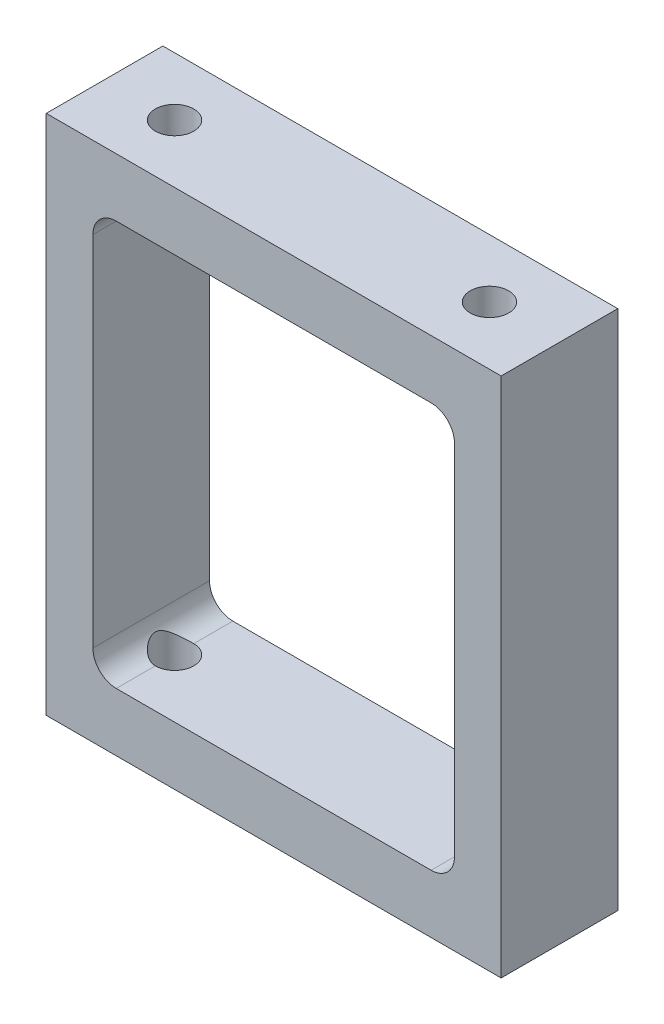
ISO-10303-21;
HEADER;
FILE_DESCRIPTION(('STEP AP214'),'2;1');
FILE_NAME('part.step','',(''),(''),'','','');
FILE_SCHEMA(('AUTOMOTIVE_DESIGN { 1 0 10303 214 1 1 1 1 }'));
ENDSEC;
DATA;
#1=APPLICATION_CONTEXT('core data for automotive mechanical design processes');
#2=APPLICATION_PROTOCOL_DEFINITION('international standard','automotive_design',2000,#1);
#3=PRODUCT_CONTEXT('',#1,'mechanical');
#4=PRODUCT('Part','Part','',(#3));
#5=PRODUCT_RELATED_PRODUCT_CATEGORY('part','',(#4));
#6=PRODUCT_DEFINITION_FORMATION('','',#4);
#7=PRODUCT_DEFINITION_CONTEXT('part definition',#1,'design');
#8=PRODUCT_DEFINITION('design','',#6,#7);
#9=PRODUCT_DEFINITION_SHAPE('','',#8);
#10=(LENGTH_UNIT() NAMED_UNIT(*) SI_UNIT(.MILLI.,.METRE.));
#11=(NAMED_UNIT(*) PLANE_ANGLE_UNIT() SI_UNIT($,.RADIAN.));
#12=(NAMED_UNIT(*) SI_UNIT($,.STERADIAN.) SOLID_ANGLE_UNIT());
#13=UNCERTAINTY_MEASURE_WITH_UNIT(LENGTH_MEASURE(1.E-05),#10,'distance_accuracy_value','');
#14=(GEOMETRIC_REPRESENTATION_CONTEXT(3) GLOBAL_UNCERTAINTY_ASSIGNED_CONTEXT((#13)) GLOBAL_UNIT_ASSIGNED_CONTEXT((#10,
#11,#12)) REPRESENTATION_CONTEXT('',''));
#15=CARTESIAN_POINT('',(0.,0.,0.));
#16=DIRECTION('',(0.,0.,1.));
#17=DIRECTION('',(1.,0.,0.));
#18=AXIS2_PLACEMENT_3D('',#15,#16,#17);
#19=CARTESIAN_POINT('',(0.,22.35,-5.));
#20=DIRECTION('',(1.,0.,0.));
#21=DIRECTION('',(0.,0.,-1.));
#22=AXIS2_PLACEMENT_3D('',#19,#20,#21);
#23=PLANE('',#22);
#24=DIRECTION('',(0.,0.,1.));
#25=VECTOR('',#24,1.);
#26=CARTESIAN_POINT('',(0.,-22.35,-5.));
#27=LINE('',#26,#25);
#28=CARTESIAN_POINT('',(0.,-22.35,-5.));
#29=VERTEX_POINT('',#28);
#30=CARTESIAN_POINT('',(0.,-22.35,5.));
#31=VERTEX_POINT('',#30);
#32=EDGE_CURVE('E246',#29,#31,#27,.T.);
#33=ORIENTED_EDGE('',*,*,#32,.T.);
#34=DIRECTION('',(0.,-1.,0.));
#35=VECTOR('',#34,1.);
#36=CARTESIAN_POINT('',(0.,22.35,5.));
#37=LINE('',#36,#35);
#38=CARTESIAN_POINT('',(0.,22.35,5.));
#39=VERTEX_POINT('',#38);
#40=EDGE_CURVE('E273',#39,#31,#37,.T.);
#41=ORIENTED_EDGE('',*,*,#40,.F.);
#42=DIRECTION('',(0.,0.,1.));
#43=VECTOR('',#42,1.);
#44=CARTESIAN_POINT('',(0.,22.35,-5.));
#45=LINE('',#44,#43);
#46=CARTESIAN_POINT('',(0.,22.35,-5.));
#47=VERTEX_POINT('',#46);
#48=EDGE_CURVE('E247',#47,#39,#45,.T.);
#49=ORIENTED_EDGE('',*,*,#48,.F.);
#50=DIRECTION('',(0.,-1.,0.));
#51=VECTOR('',#50,1.);
#52=CARTESIAN_POINT('',(0.,22.35,-5.));
#53=LINE('',#52,#51);
#54=EDGE_CURVE('E257',#47,#29,#53,.T.);
#55=ORIENTED_EDGE('',*,*,#54,.T.);
#56=EDGE_LOOP('',(#33,#41,#49,#55));
#57=FACE_BOUND('',#56,.T.);
#58=ADVANCED_FACE('F32',(#57),#23,.F.);
#59=CARTESIAN_POINT('',(0.,22.35,5.));
#60=DIRECTION('',(0.,0.,-1.));
#61=DIRECTION('',(-1.,0.,0.));
#62=AXIS2_PLACEMENT_3D('',#59,#60,#61);
#63=PLANE('',#62);
#64=DIRECTION('',(0.,1.,0.));
#65=VECTOR('',#64,1.);
#66=CARTESIAN_POINT('',(4.,15.35,5.));
#67=LINE('',#66,#65);
#68=CARTESIAN_POINT('',(4.,-15.35,5.));
#69=VERTEX_POINT('',#68);
#70=CARTESIAN_POINT('',(4.,15.35,5.));
#71=VERTEX_POINT('',#70);
#72=EDGE_CURVE('E173',#69,#71,#67,.T.);
#73=ORIENTED_EDGE('',*,*,#72,.T.);
#74=CARTESIAN_POINT('',(6.,15.35,5.));
#75=DIRECTION('',(0.,0.,-1.));
#76=DIRECTION('',(1.,0.,0.));
#77=AXIS2_PLACEMENT_3D('',#74,#75,#76);
#78=CIRCLE('',#77,2.);
#79=CARTESIAN_POINT('',(6.00000000000001,17.35,5.));
#80=VERTEX_POINT('',#79);
#81=EDGE_CURVE('E154',#71,#80,#78,.T.);
#82=ORIENTED_EDGE('',*,*,#81,.T.);
#83=DIRECTION('',(1.,0.,0.));
#84=VECTOR('',#83,1.);
#85=CARTESIAN_POINT('',(33.,17.35,5.));
#86=LINE('',#85,#84);
#87=CARTESIAN_POINT('',(33.,17.35,5.));
#88=VERTEX_POINT('',#87);
#89=EDGE_CURVE('E164',#80,#88,#86,.T.);
#90=ORIENTED_EDGE('',*,*,#89,.T.);
#91=CARTESIAN_POINT('',(33.,15.35,5.));
#92=DIRECTION('',(0.,0.,-1.));
#93=DIRECTION('',(-1.,0.,0.));
#94=AXIS2_PLACEMENT_3D('',#91,#92,#93);
#95=CIRCLE('',#94,2.);
#96=CARTESIAN_POINT('',(35.,15.35,5.));
#97=VERTEX_POINT('',#96);
#98=EDGE_CURVE('E51',#88,#97,#95,.T.);
#99=ORIENTED_EDGE('',*,*,#98,.T.);
#100=DIRECTION('',(0.,-1.,0.));
#101=VECTOR('',#100,1.);
#102=CARTESIAN_POINT('',(35.,15.35,5.));
#103=LINE('',#102,#101);
#104=CARTESIAN_POINT('',(35.,-15.35,5.));
#105=VERTEX_POINT('',#104);
#106=EDGE_CURVE('E181',#97,#105,#103,.T.);
#107=ORIENTED_EDGE('',*,*,#106,.T.);
#108=CARTESIAN_POINT('',(33.,-15.35,5.));
#109=DIRECTION('',(0.,0.,-1.));
#110=DIRECTION('',(-1.,0.,0.));
#111=AXIS2_PLACEMENT_3D('',#108,#109,#110);
#112=CIRCLE('',#111,2.);
#113=CARTESIAN_POINT('',(33.,-17.35,5.));
#114=VERTEX_POINT('',#113);
#115=EDGE_CURVE('E184',#105,#114,#112,.T.);
#116=ORIENTED_EDGE('',*,*,#115,.T.);
#117=DIRECTION('',(-1.,0.,0.));
#118=VECTOR('',#117,1.);
#119=CARTESIAN_POINT('',(33.,-17.35,5.));
#120=LINE('',#119,#118);
#121=CARTESIAN_POINT('',(6.00000000000001,-17.35,5.));
#122=VERTEX_POINT('',#121);
#123=EDGE_CURVE('E187',#114,#122,#120,.T.);
#124=ORIENTED_EDGE('',*,*,#123,.T.);
#125=CARTESIAN_POINT('',(6.,-15.35,5.));
#126=DIRECTION('',(0.,0.,-1.));
#127=DIRECTION('',(-1.,0.,0.));
#128=AXIS2_PLACEMENT_3D('',#125,#126,#127);
#129=CIRCLE('',#128,2.);
#130=EDGE_CURVE('E190',#122,#69,#129,.T.);
#131=ORIENTED_EDGE('',*,*,#130,.T.);
#132=EDGE_LOOP('',(#73,#82,#90,#99,#107,#116,#124,#131));
#133=FACE_BOUND('',#132,.T.);
#134=DIRECTION('',(1.,0.,0.));
#135=VECTOR('',#134,1.);
#136=CARTESIAN_POINT('',(0.,-22.35,5.));
#137=LINE('',#136,#135);
#138=CARTESIAN_POINT('',(39.,-22.35,5.));
#139=VERTEX_POINT('',#138);
#140=EDGE_CURVE('E260',#31,#139,#137,.T.);
#141=ORIENTED_EDGE('',*,*,#140,.T.);
#142=DIRECTION('',(0.,-1.,0.));
#143=VECTOR('',#142,1.);
#144=CARTESIAN_POINT('',(39.,22.35,5.));
#145=LINE('',#144,#143);
#146=CARTESIAN_POINT('',(39.,22.35,5.));
#147=VERTEX_POINT('',#146);
#148=EDGE_CURVE('E270',#147,#139,#145,.T.);
#149=ORIENTED_EDGE('',*,*,#148,.F.);
#150=DIRECTION('',(1.,0.,0.));
#151=VECTOR('',#150,1.);
#152=CARTESIAN_POINT('',(0.,22.35,5.));
#153=LINE('',#152,#151);
#154=EDGE_CURVE('E250',#39,#147,#153,.T.);
#155=ORIENTED_EDGE('',*,*,#154,.F.);
#156=ORIENTED_EDGE('',*,*,#40,.T.);
#157=EDGE_LOOP('',(#141,#149,#155,#156));
#158=FACE_BOUND('',#157,.T.);
#159=ADVANCED_FACE('F169',(#133,#158),#63,.F.);
#160=CARTESIAN_POINT('',(39.,22.35,-5.));
#161=DIRECTION('',(-1.,0.,0.));
#162=DIRECTION('',(0.,0.,1.));
#163=AXIS2_PLACEMENT_3D('',#160,#161,#162);
#164=PLANE('',#163);
#165=DIRECTION('',(0.,0.,-1.));
#166=VECTOR('',#165,1.);
#167=CARTESIAN_POINT('',(39.,-22.35,-5.));
#168=LINE('',#167,#166);
#169=CARTESIAN_POINT('',(39.,-22.35,-5.));
#170=VERTEX_POINT('',#169);
#171=EDGE_CURVE('E262',#139,#170,#168,.T.);
#172=ORIENTED_EDGE('',*,*,#171,.T.);
#173=DIRECTION('',(0.,-1.,0.));
#174=VECTOR('',#173,1.);
#175=CARTESIAN_POINT('',(39.,22.35,-5.));
#176=LINE('',#175,#174);
#177=CARTESIAN_POINT('',(39.,22.35,-5.));
#178=VERTEX_POINT('',#177);
#179=EDGE_CURVE('E267',#178,#170,#176,.T.);
#180=ORIENTED_EDGE('',*,*,#179,.F.);
#181=DIRECTION('',(0.,0.,-1.));
#182=VECTOR('',#181,1.);
#183=CARTESIAN_POINT('',(39.,22.35,-5.));
#184=LINE('',#183,#182);
#185=EDGE_CURVE('E253',#147,#178,#184,.T.);
#186=ORIENTED_EDGE('',*,*,#185,.F.);
#187=ORIENTED_EDGE('',*,*,#148,.T.);
#188=EDGE_LOOP('',(#172,#180,#186,#187));
#189=FACE_BOUND('',#188,.T.);
#190=ADVANCED_FACE('F340',(#189),#164,.F.);
#191=CARTESIAN_POINT('',(0.,22.35,-5.));
#192=DIRECTION('',(0.,0.,1.));
#193=DIRECTION('',(1.,0.,0.));
#194=AXIS2_PLACEMENT_3D('',#191,#192,#193);
#195=PLANE('',#194);
#196=DIRECTION('',(1.,0.,0.));
#197=VECTOR('',#196,1.);
#198=CARTESIAN_POINT('',(33.,17.35,-5.));
#199=LINE('',#198,#197);
#200=CARTESIAN_POINT('',(6.00000000000001,17.35,-5.));
#201=VERTEX_POINT('',#200);
#202=CARTESIAN_POINT('',(33.,17.35,-5.));
#203=VERTEX_POINT('',#202);
#204=EDGE_CURVE('E194',#201,#203,#199,.T.);
#205=ORIENTED_EDGE('',*,*,#204,.F.);
#206=CARTESIAN_POINT('',(6.,15.35,-5.));
#207=DIRECTION('',(0.,0.,-1.));
#208=DIRECTION('',(1.,0.,0.));
#209=AXIS2_PLACEMENT_3D('',#206,#207,#208);
#210=CIRCLE('',#209,2.);
#211=CARTESIAN_POINT('',(4.,15.35,-5.));
#212=VERTEX_POINT('',#211);
#213=EDGE_CURVE('E59',#212,#201,#210,.T.);
#214=ORIENTED_EDGE('',*,*,#213,.F.);
#215=DIRECTION('',(0.,1.,0.));
#216=VECTOR('',#215,1.);
#217=CARTESIAN_POINT('',(4.,15.35,-5.));
#218=LINE('',#217,#216);
#219=CARTESIAN_POINT('',(4.,-15.35,-5.));
#220=VERTEX_POINT('',#219);
#221=EDGE_CURVE('E174',#220,#212,#218,.T.);
#222=ORIENTED_EDGE('',*,*,#221,.F.);
#223=CARTESIAN_POINT('',(6.,-15.35,-5.));
#224=DIRECTION('',(0.,0.,-1.));
#225=DIRECTION('',(-1.,0.,0.));
#226=AXIS2_PLACEMENT_3D('',#223,#224,#225);
#227=CIRCLE('',#226,2.);
#228=CARTESIAN_POINT('',(6.00000000000001,-17.35,-5.));
#229=VERTEX_POINT('',#228);
#230=EDGE_CURVE('E177',#229,#220,#227,.T.);
#231=ORIENTED_EDGE('',*,*,#230,.F.);
#232=DIRECTION('',(-1.,0.,0.));
#233=VECTOR('',#232,1.);
#234=CARTESIAN_POINT('',(33.,-17.35,-5.));
#235=LINE('',#234,#233);
#236=CARTESIAN_POINT('',(33.,-17.35,-5.));
#237=VERTEX_POINT('',#236);
#238=EDGE_CURVE('E206',#237,#229,#235,.T.);
#239=ORIENTED_EDGE('',*,*,#238,.F.);
#240=CARTESIAN_POINT('',(33.,-15.35,-5.));
#241=DIRECTION('',(0.,0.,-1.));
#242=DIRECTION('',(-1.,0.,0.));
#243=AXIS2_PLACEMENT_3D('',#240,#241,#242);
#244=CIRCLE('',#243,2.);
#245=CARTESIAN_POINT('',(35.,-15.35,-5.));
#246=VERTEX_POINT('',#245);
#247=EDGE_CURVE('E203',#246,#237,#244,.T.);
#248=ORIENTED_EDGE('',*,*,#247,.F.);
#249=DIRECTION('',(0.,-1.,0.));
#250=VECTOR('',#249,1.);
#251=CARTESIAN_POINT('',(35.,15.35,-5.));
#252=LINE('',#251,#250);
#253=CARTESIAN_POINT('',(35.,15.35,-5.));
#254=VERTEX_POINT('',#253);
#255=EDGE_CURVE('E200',#254,#246,#252,.T.);
#256=ORIENTED_EDGE('',*,*,#255,.F.);
#257=CARTESIAN_POINT('',(33.,15.35,-5.));
#258=DIRECTION('',(0.,0.,-1.));
#259=DIRECTION('',(-1.,0.,0.));
#260=AXIS2_PLACEMENT_3D('',#257,#258,#259);
#261=CIRCLE('',#260,2.);
#262=EDGE_CURVE('E197',#203,#254,#261,.T.);
#263=ORIENTED_EDGE('',*,*,#262,.F.);
#264=EDGE_LOOP('',(#205,#214,#222,#231,#239,#248,#256,#263));
#265=FACE_BOUND('',#264,.T.);
#266=DIRECTION('',(-1.,0.,0.));
#267=VECTOR('',#266,1.);
#268=CARTESIAN_POINT('',(0.,-22.35,-5.));
#269=LINE('',#268,#267);
#270=EDGE_CURVE('E251',#170,#29,#269,.T.);
#271=ORIENTED_EDGE('',*,*,#270,.T.);
#272=ORIENTED_EDGE('',*,*,#54,.F.);
#273=DIRECTION('',(-1.,0.,0.));
#274=VECTOR('',#273,1.);
#275=CARTESIAN_POINT('',(0.,22.35,-5.));
#276=LINE('',#275,#274);
#277=EDGE_CURVE('E255',#178,#47,#276,.T.);
#278=ORIENTED_EDGE('',*,*,#277,.F.);
#279=ORIENTED_EDGE('',*,*,#179,.T.);
#280=EDGE_LOOP('',(#271,#272,#278,#279));
#281=FACE_BOUND('',#280,.T.);
#282=ADVANCED_FACE('F333',(#265,#281),#195,.F.);
#283=CARTESIAN_POINT('',(0.,22.35,5.));
#284=DIRECTION('',(0.,1.,0.));
#285=DIRECTION('',(0.,0.,1.));
#286=AXIS2_PLACEMENT_3D('',#283,#284,#285);
#287=PLANE('',#286);
#288=CARTESIAN_POINT('',(5.99999999999997,22.35,0.));
#289=DIRECTION('',(0.,1.,0.));
#290=DIRECTION('',(0.,0.,1.));
#291=AXIS2_PLACEMENT_3D('',#288,#289,#290);
#292=CIRCLE('',#291,1.64999999999999);
#293=CARTESIAN_POINT('',(5.99999999999997,22.35,1.65000000000001));
#294=VERTEX_POINT('',#293);
#295=EDGE_CURVE('E234',#294,#294,#292,.T.);
#296=ORIENTED_EDGE('',*,*,#295,.F.);
#297=EDGE_LOOP('',(#296));
#298=FACE_BOUND('',#297,.T.);
#299=CARTESIAN_POINT('',(32.9999999999999,22.35,1.066979837816E-13));
#300=DIRECTION('',(0.,1.,0.));
#301=DIRECTION('',(0.,0.,1.));
#302=AXIS2_PLACEMENT_3D('',#299,#300,#301);
#303=CIRCLE('',#302,1.64999999999999);
#304=CARTESIAN_POINT('',(32.9999999999999,22.35,1.6500000000001));
#305=VERTEX_POINT('',#304);
#306=EDGE_CURVE('E237',#305,#305,#303,.T.);
#307=ORIENTED_EDGE('',*,*,#306,.F.);
#308=EDGE_LOOP('',(#307));
#309=FACE_BOUND('',#308,.T.);
#310=ORIENTED_EDGE('',*,*,#48,.T.);
#311=ORIENTED_EDGE('',*,*,#154,.T.);
#312=ORIENTED_EDGE('',*,*,#185,.T.);
#313=ORIENTED_EDGE('',*,*,#277,.T.);
#314=EDGE_LOOP('',(#310,#311,#312,#313));
#315=FACE_BOUND('',#314,.T.);
#316=ADVANCED_FACE('F330',(#298,#309,#315),#287,.T.);
#317=CARTESIAN_POINT('',(0.,-22.35,5.));
#318=DIRECTION('',(0.,1.,0.));
#319=DIRECTION('',(0.,0.,1.));
#320=AXIS2_PLACEMENT_3D('',#317,#318,#319);
#321=PLANE('',#320);
#322=CARTESIAN_POINT('',(33.,-22.35,0.));
#323=DIRECTION('',(0.,-1.,0.));
#324=DIRECTION('',(0.,0.,-1.));
#325=AXIS2_PLACEMENT_3D('',#322,#323,#324);
#326=CIRCLE('',#325,1.64999999999999);
#327=CARTESIAN_POINT('',(33.,-22.35,-1.64999999999999));
#328=VERTEX_POINT('',#327);
#329=EDGE_CURVE('E240',#328,#328,#326,.T.);
#330=ORIENTED_EDGE('',*,*,#329,.F.);
#331=EDGE_LOOP('',(#330));
#332=FACE_BOUND('',#331,.T.);
#333=CARTESIAN_POINT('',(6.,-22.35,0.));
#334=DIRECTION('',(0.,-1.,0.));
#335=DIRECTION('',(0.,0.,-1.));
#336=AXIS2_PLACEMENT_3D('',#333,#334,#335);
#337=CIRCLE('',#336,1.64999999999999);
#338=CARTESIAN_POINT('',(6.,-22.35,-1.64999999999999));
#339=VERTEX_POINT('',#338);
#340=EDGE_CURVE('E243',#339,#339,#337,.T.);
#341=ORIENTED_EDGE('',*,*,#340,.F.);
#342=EDGE_LOOP('',(#341));
#343=FACE_BOUND('',#342,.T.);
#344=ORIENTED_EDGE('',*,*,#32,.F.);
#345=ORIENTED_EDGE('',*,*,#270,.F.);
#346=ORIENTED_EDGE('',*,*,#171,.F.);
#347=ORIENTED_EDGE('',*,*,#140,.F.);
#348=EDGE_LOOP('',(#344,#345,#346,#347));
#349=FACE_BOUND('',#348,.T.);
#350=ADVANCED_FACE('F328',(#332,#343,#349),#321,.F.);
#351=CARTESIAN_POINT('',(6.,-22.35,0.));
#352=DIRECTION('',(0.,-1.,0.));
#353=DIRECTION('',(0.,0.,-1.));
#354=AXIS2_PLACEMENT_3D('',#351,#352,#353);
#355=CYLINDRICAL_SURFACE('',#354,1.64999999999999);
#356=CARTESIAN_POINT('',(6.,-17.35,0.));
#357=DIRECTION('',(0.,-1.,0.));
#358=DIRECTION('',(0.,0.,-1.));
#359=AXIS2_PLACEMENT_3D('',#356,#357,#358);
#360=CIRCLE('',#359,1.64999999999999);
#361=CARTESIAN_POINT('',(6.00000000000001,-17.35,1.64999999999999));
#362=VERTEX_POINT('',#361);
#363=CARTESIAN_POINT('',(6.00000000000001,-17.35,-1.64999999999999));
#364=VERTEX_POINT('',#363);
#365=EDGE_CURVE('E231',#362,#364,#360,.F.);
#366=ORIENTED_EDGE('',*,*,#365,.T.);
#367=CARTESIAN_POINT('',(6.00000000000001,-17.35,-1.64999999999999));
#368=CARTESIAN_POINT('',(5.96049835719959,-17.3500093366325,-1.65000888993329));
#369=CARTESIAN_POINT('',(5.92100357958309,-17.3488300142288,-1.6485817783361));
#370=CARTESIAN_POINT('',(5.84237924394451,-17.344165393535,-1.64292430907507));
#371=CARTESIAN_POINT('',(5.80324945019513,-17.3406817057332,-1.63869590918877));
#372=CARTESIAN_POINT('',(5.72594669485255,-17.3315146371609,-1.62754716114894));
#373=CARTESIAN_POINT('',(5.68776870931392,-17.3258482511989,-1.62064760893147));
#374=CARTESIAN_POINT('',(5.61234501026982,-17.3124456935377,-1.60428017243871));
#375=CARTESIAN_POINT('',(5.57509941519053,-17.3047092603586,-1.59481196369907));
#376=CARTESIAN_POINT('',(5.4653192723759,-17.2786642213471,-1.56281861006013));
#377=CARTESIAN_POINT('',(5.39447692919432,-17.2574869605002,-1.53666525676922));
#378=CARTESIAN_POINT('',(5.25871049456505,-17.2089564532166,-1.47599071091962));
#379=CARTESIAN_POINT('',(5.19379797019118,-17.1815914832034,-1.44145362482158));
#380=CARTESIAN_POINT('',(5.04829551021926,-17.1115084599505,-1.35147475979459));
#381=CARTESIAN_POINT('',(4.97053040744154,-17.0668177036186,-1.29299053088739));
#382=CARTESIAN_POINT('',(4.82773235519044,-16.972696229288,-1.16512935081145));
#383=CARTESIAN_POINT('',(4.76273366083877,-16.9232532749176,-1.0957239697466));
#384=CARTESIAN_POINT('',(4.64457062566783,-16.8227160788534,-0.945827423292818));
#385=CARTESIAN_POINT('',(4.5916393571113,-16.7716081246226,-0.865159810945172));
#386=CARTESIAN_POINT('',(4.52276703953914,-16.6986706433643,-0.736633986272377));
#387=CARTESIAN_POINT('',(4.5015762933955,-16.6749961261848,-0.692575742646277));
#388=CARTESIAN_POINT('',(4.46286910538348,-16.6298854979981,-0.601799883978219));
#389=CARTESIAN_POINT('',(4.44534950768754,-16.6084474724645,-0.555084597302244));
#390=CARTESIAN_POINT('',(4.41261908115696,-16.566960773937,-0.453710567341662));
#391=CARTESIAN_POINT('',(4.39785797983786,-16.547308285361,-0.398737436829127));
#392=CARTESIAN_POINT('',(4.37391235257548,-16.5145835808212,-0.285757466683441));
#393=CARTESIAN_POINT('',(4.36471406956167,-16.5014951455072,-0.227758499540718));
#394=CARTESIAN_POINT('',(4.35251989547831,-16.4839911110559,-0.109060866069474));
#395=CARTESIAN_POINT('',(4.34959478122422,-16.4796745080263,-0.0483392044011553));
#396=CARTESIAN_POINT('',(4.35049698933484,-16.4809903668604,0.0729497553157568));
#397=CARTESIAN_POINT('',(4.35432627093733,-16.4866257154728,0.133517003470169));
#398=CARTESIAN_POINT('',(4.36904247197162,-16.5076469040165,0.258565832957272));
#399=CARTESIAN_POINT('',(4.38062516697627,-16.5239902255878,0.32279495599947));
#400=CARTESIAN_POINT('',(4.41048829324412,-16.5641151222874,0.447300691311721));
#401=CARTESIAN_POINT('',(4.42879020320538,-16.5879205146577,0.507563889393329));
#402=CARTESIAN_POINT('',(4.4832678843798,-16.6547069375042,0.656849901018385));
#403=CARTESIAN_POINT('',(4.5236973741878,-16.7009158343865,0.742848308278831));
#404=CARTESIAN_POINT('',(4.61741526310385,-16.7967194526606,0.905412306291185));
#405=CARTESIAN_POINT('',(4.6707260642898,-16.8463199635112,0.981961108791271));
#406=CARTESIAN_POINT('',(4.7925739232234,-16.946440209234,1.12876613384931));
#407=CARTESIAN_POINT('',(4.86168243360267,-16.996902810408,1.19859143446194));
#408=CARTESIAN_POINT('',(5.01348069967801,-17.0920599218006,1.32629836057149));
#409=CARTESIAN_POINT('',(5.09614012694003,-17.1367669235916,1.3842060207402));
#410=CARTESIAN_POINT('',(5.25109070030484,-17.205895792493,1.47220145151398));
#411=CARTESIAN_POINT('',(5.32048932293199,-17.232569555938,1.50560780047653));
#412=CARTESIAN_POINT('',(5.46527537993758,-17.2786812560983,1.56288250300138));
#413=CARTESIAN_POINT('',(5.54064885609302,-17.2981354874831,1.58677234463145));
#414=CARTESIAN_POINT('',(5.67980466136344,-17.3252009228653,1.61987295906394));
#415=CARTESIAN_POINT('',(5.74279426414305,-17.3344226517707,1.6310893093659));
#416=CARTESIAN_POINT('',(5.83848348309435,-17.3437275206947,1.64239264968729));
#417=CARTESIAN_POINT('',(5.8706634476859,-17.3460746747289,1.6452403809611));
#418=CARTESIAN_POINT('',(5.93522514180034,-17.3492126443975,1.64904569674568));
#419=CARTESIAN_POINT('',(5.96760695777678,-17.3500027395351,1.65000240622601));
#420=CARTESIAN_POINT('',(6.00000000000001,-17.35,1.64999999999999));
#421=B_SPLINE_CURVE_WITH_KNOTS('',3,(#367,#368,#369,#370,#371,#372,#373,#374,#375,#376,#377,
#378,#379,#380,#381,#382,#383,#384,#385,#386,#387,#388,#389,#390,#391,#392,#393,#394,#395,#396,
#397,#398,#399,#400,#401,#402,#403,#404,#405,#406,#407,#408,#409,#410,#411,#412,#413,#414,#415,
#416,#417,#418,#419,#420),.UNSPECIFIED.,.F.,.F.,(4,2,2,2,2,2,2,2,2,2,2,2,2,2,2,2,2,2,2,2,2,2,2,
2,2,2,4),(0.,0.118450357748397,0.236818019560927,0.354282097834331,0.471761020702214,
0.705921270008078,0.940528945980004,1.26001708005691,1.58035109956882,1.9064283960907,
2.06921007327552,2.23185123921182,2.41195153080817,2.59160458624409,2.77327413444065,
2.95499638792529,3.15571062461661,3.35707213338218,3.67238726835981,3.98825477017755,
4.31816189396414,4.64734048488901,4.89092760300522,5.13396154589644,5.32715665728657,
5.42424555606871,5.5213793701829),.UNSPECIFIED.);
#422=EDGE_CURVE('E11',#364,#362,#421,.T.);
#423=ORIENTED_EDGE('',*,*,#422,.T.);
#424=EDGE_LOOP('',(#366,#423));
#425=FACE_BOUND('',#424,.T.);
#426=ORIENTED_EDGE('',*,*,#340,.T.);
#427=EDGE_LOOP('',(#426));
#428=FACE_BOUND('',#427,.T.);
#429=ADVANCED_FACE('F322',(#425,#428),#355,.F.);
#430=CARTESIAN_POINT('',(33.,-22.35,0.));
#431=DIRECTION('',(0.,-1.,0.));
#432=DIRECTION('',(0.,0.,-1.));
#433=AXIS2_PLACEMENT_3D('',#430,#431,#432);
#434=CYLINDRICAL_SURFACE('',#433,1.64999999999999);
#435=CARTESIAN_POINT('',(33.,-17.35,1.64999999999999));
#436=CARTESIAN_POINT('',(33.0395016428004,-17.3500093366325,1.65000888993329));
#437=CARTESIAN_POINT('',(33.0789964204169,-17.3488300142288,1.6485817783361));
#438=CARTESIAN_POINT('',(33.1576207560555,-17.344165393535,1.64292430907507));
#439=CARTESIAN_POINT('',(33.1967505498049,-17.3406817057332,1.63869590918877));
#440=CARTESIAN_POINT('',(33.2740533051474,-17.3315146371609,1.62754716114894));
#441=CARTESIAN_POINT('',(33.3122312906861,-17.3258482511989,1.62064760893148));
#442=CARTESIAN_POINT('',(33.3876549897302,-17.3124456935377,1.60428017243871));
#443=CARTESIAN_POINT('',(33.4249005848095,-17.3047092603586,1.59481196369907));
#444=CARTESIAN_POINT('',(33.5346807276241,-17.2786642213471,1.56281861006014));
#445=CARTESIAN_POINT('',(33.6055230708057,-17.2574869605002,1.53666525676922));
#446=CARTESIAN_POINT('',(33.7412895054349,-17.2089564532166,1.47599071091963));
#447=CARTESIAN_POINT('',(33.8062020298088,-17.1815914832034,1.44145362482159));
#448=CARTESIAN_POINT('',(33.9517044897807,-17.1115084599505,1.35147475979461));
#449=CARTESIAN_POINT('',(34.0294695925584,-17.0668177036186,1.2929905308874));
#450=CARTESIAN_POINT('',(34.1722676448095,-16.972696229288,1.16512935081147));
#451=CARTESIAN_POINT('',(34.2372663391612,-16.9232532749176,1.09572396974662));
#452=CARTESIAN_POINT('',(34.3554293743322,-16.8227160788534,0.945827423292838));
#453=CARTESIAN_POINT('',(34.4083606428887,-16.7716081246226,0.865159810945195));
#454=CARTESIAN_POINT('',(34.4772329604608,-16.6986706433643,0.736633986272403));
#455=CARTESIAN_POINT('',(34.4984237066045,-16.6749961261848,0.692575742646304));
#456=CARTESIAN_POINT('',(34.5371308946165,-16.6298854979981,0.601799883978246));
#457=CARTESIAN_POINT('',(34.5546504923125,-16.6084474724645,0.555084597302272));
#458=CARTESIAN_POINT('',(34.587380918843,-16.566960773937,0.45371056734169));
#459=CARTESIAN_POINT('',(34.6021420201621,-16.547308285361,0.398737436829156));
#460=CARTESIAN_POINT('',(34.6260876474245,-16.5145835808212,0.28575746668347));
#461=CARTESIAN_POINT('',(34.6352859304383,-16.5014951455072,0.227758499540747));
#462=CARTESIAN_POINT('',(34.6474801045217,-16.4839911110558,0.109060866069502));
#463=CARTESIAN_POINT('',(34.6504052187758,-16.4796745080263,0.0483392044011828));
#464=CARTESIAN_POINT('',(34.6495030106652,-16.4809903668604,-0.0729497553157307));
#465=CARTESIAN_POINT('',(34.6456737290627,-16.4866257154728,-0.133517003470144));
#466=CARTESIAN_POINT('',(34.6309575280284,-16.5076469040165,-0.258565832957246));
#467=CARTESIAN_POINT('',(34.6193748330237,-16.5239902255878,-0.322794955999443));
#468=CARTESIAN_POINT('',(34.5895117067559,-16.5641151222874,-0.447300691311691));
#469=CARTESIAN_POINT('',(34.5712097967946,-16.5879205146577,-0.507563889393297));
#470=CARTESIAN_POINT('',(34.5167321156202,-16.6547069375041,-0.656849901018348));
#471=CARTESIAN_POINT('',(34.4763026258122,-16.7009158343865,-0.742848308278793));
#472=CARTESIAN_POINT('',(34.3825847368962,-16.7967194526606,-0.905412306291145));
#473=CARTESIAN_POINT('',(34.3292739357102,-16.8463199635111,-0.98196110879123));
#474=CARTESIAN_POINT('',(34.2074260767766,-16.9464402092339,-1.12876613384927));
#475=CARTESIAN_POINT('',(34.1383175663974,-16.996902810408,-1.1985914344619));
#476=CARTESIAN_POINT('',(33.986519300322,-17.0920599218006,-1.32629836057145));
#477=CARTESIAN_POINT('',(33.90385987306,-17.1367669235915,-1.38420602074016));
#478=CARTESIAN_POINT('',(33.7489092996952,-17.205895792493,-1.47220145151394));
#479=CARTESIAN_POINT('',(33.6795106770681,-17.2325695559379,-1.5056078004765));
#480=CARTESIAN_POINT('',(33.5347246200625,-17.2786812560983,-1.56288250300135));
#481=CARTESIAN_POINT('',(33.459351143907,-17.2981354874831,-1.58677234463143));
#482=CARTESIAN_POINT('',(33.3201953386366,-17.3252009228653,-1.61987295906393));
#483=CARTESIAN_POINT('',(33.257205735857,-17.3344226517707,-1.63108930936589));
#484=CARTESIAN_POINT('',(33.1615165169057,-17.3437275206947,-1.64239264968729));
#485=CARTESIAN_POINT('',(33.1293365523141,-17.3460746747289,-1.6452403809611));
#486=CARTESIAN_POINT('',(33.0647748581997,-17.3492126443975,-1.64904569674568));
#487=CARTESIAN_POINT('',(33.0323930422232,-17.3500027395351,-1.65000240622601));
#488=CARTESIAN_POINT('',(33.,-17.35,-1.64999999999999));
#489=B_SPLINE_CURVE_WITH_KNOTS('',3,(#435,#436,#437,#438,#439,#440,#441,#442,#443,#444,#445,
#446,#447,#448,#449,#450,#451,#452,#453,#454,#455,#456,#457,#458,#459,#460,#461,#462,#463,#464,
#465,#466,#467,#468,#469,#470,#471,#472,#473,#474,#475,#476,#477,#478,#479,#480,#481,#482,#483,
#484,#485,#486,#487,#488),.UNSPECIFIED.,.F.,.F.,(4,2,2,2,2,2,2,2,2,2,2,2,2,2,2,2,2,2,2,2,2,2,2,
2,2,2,4),(0.,0.118450357748397,0.236818019560928,0.354282097834331,0.471761020702209,
0.705921270008073,0.940528945979995,1.2600170800569,1.5803510995688,1.90642839609068,
2.0692100732755,2.2318512392118,2.41195153080816,2.59160458624407,2.77327413444064,
2.95499638792528,3.15571062461659,3.35707213338216,3.67238726835978,3.98825477017751,
4.3181618939641,4.64734048488896,4.89092760300517,5.1339615458964,5.32715665728656,
5.42424555606872,5.52137937018293),.UNSPECIFIED.);
#490=CARTESIAN_POINT('',(33.,-17.35,1.64999999999999));
#491=VERTEX_POINT('',#490);
#492=CARTESIAN_POINT('',(33.,-17.35,-1.64999999999999));
#493=VERTEX_POINT('',#492);
#494=EDGE_CURVE('E312',#491,#493,#489,.T.);
#495=ORIENTED_EDGE('',*,*,#494,.T.);
#496=CARTESIAN_POINT('',(33.,-17.35,0.));
#497=DIRECTION('',(0.,-1.,0.));
#498=DIRECTION('',(0.,0.,-1.));
#499=AXIS2_PLACEMENT_3D('',#496,#497,#498);
#500=CIRCLE('',#499,1.64999999999999);
#501=EDGE_CURVE('E44',#493,#491,#500,.F.);
#502=ORIENTED_EDGE('',*,*,#501,.T.);
#503=EDGE_LOOP('',(#495,#502));
#504=FACE_BOUND('',#503,.T.);
#505=ORIENTED_EDGE('',*,*,#329,.T.);
#506=EDGE_LOOP('',(#505));
#507=FACE_BOUND('',#506,.T.);
#508=ADVANCED_FACE('F318',(#504,#507),#434,.F.);
#509=CARTESIAN_POINT('',(32.9999999999999,22.35,1.066979837816E-13));
#510=DIRECTION('',(0.,1.,0.));
#511=DIRECTION('',(0.,0.,1.));
#512=AXIS2_PLACEMENT_3D('',#509,#510,#511);
#513=CYLINDRICAL_SURFACE('',#512,1.64999999999999);
#514=CARTESIAN_POINT('',(32.9999999999999,17.35,1.03922426220037E-13));
#515=DIRECTION('',(0.,1.,0.));
#516=DIRECTION('',(0.,0.,1.));
#517=AXIS2_PLACEMENT_3D('',#514,#515,#516);
#518=CIRCLE('',#517,1.64999999999999);
#519=CARTESIAN_POINT('',(33.,17.35,1.65000000000009));
#520=VERTEX_POINT('',#519);
#521=CARTESIAN_POINT('',(33.,17.35,-1.64999999999988));
#522=VERTEX_POINT('',#521);
#523=EDGE_CURVE('E213',#520,#522,#518,.F.);
#524=ORIENTED_EDGE('',*,*,#523,.T.);
#525=CARTESIAN_POINT('',(33.,17.35,-1.64999999999988));
#526=CARTESIAN_POINT('',(33.0395016428004,17.3500093366325,-1.65000888993318));
#527=CARTESIAN_POINT('',(33.0789964204169,17.3488300142288,-1.64858177833599));
#528=CARTESIAN_POINT('',(33.1576207560555,17.344165393535,-1.64292430907496));
#529=CARTESIAN_POINT('',(33.1967505498049,17.3406817057332,-1.63869590918865));
#530=CARTESIAN_POINT('',(33.2740533051474,17.3315146371609,-1.62754716114882));
#531=CARTESIAN_POINT('',(33.3122312906861,17.3258482511989,-1.62064760893135));
#532=CARTESIAN_POINT('',(33.3876549897302,17.3124456935377,-1.60428017243858));
#533=CARTESIAN_POINT('',(33.4249005848095,17.3047092603586,-1.59481196369894));
#534=CARTESIAN_POINT('',(33.5346807276241,17.2786642213471,-1.56281861006));
#535=CARTESIAN_POINT('',(33.6055230708057,17.2574869605002,-1.53666525676908));
#536=CARTESIAN_POINT('',(33.7412895054349,17.2089564532166,-1.47599071091947));
#537=CARTESIAN_POINT('',(33.8062020298088,17.1815914832034,-1.44145362482142));
#538=CARTESIAN_POINT('',(33.9517044897807,17.1115084599505,-1.35147475979442));
#539=CARTESIAN_POINT('',(34.0294695925585,17.0668177036186,-1.29299053088721));
#540=CARTESIAN_POINT('',(34.1722676448096,16.972696229288,-1.16512935081126));
#541=CARTESIAN_POINT('',(34.2372663391612,16.9232532749176,-1.09572396974641));
#542=CARTESIAN_POINT('',(34.3554293743322,16.8227160788534,-0.945827423292604));
#543=CARTESIAN_POINT('',(34.4083606428887,16.7716081246226,-0.865159810944951));
#544=CARTESIAN_POINT('',(34.4772329604608,16.6986706433644,-0.736633986272145));
#545=CARTESIAN_POINT('',(34.4984237066045,16.6749961261849,-0.692575742646042));
#546=CARTESIAN_POINT('',(34.5371308946165,16.6298854979982,-0.601799883977976));
#547=CARTESIAN_POINT('',(34.5546504923124,16.6084474724646,-0.555084597301996));
#548=CARTESIAN_POINT('',(34.587380918843,16.5669607739371,-0.453710567341406));
#549=CARTESIAN_POINT('',(34.6021420201621,16.547308285361,-0.398737436828867));
#550=CARTESIAN_POINT('',(34.6260876474245,16.5145835808213,-0.285757466683174));
#551=CARTESIAN_POINT('',(34.6352859304383,16.5014951455073,-0.227758499540448));
#552=CARTESIAN_POINT('',(34.6474801045216,16.483991111056,-0.109060866069201));
#553=CARTESIAN_POINT('',(34.6504052187757,16.4796745080264,-0.0483392044008825));
#554=CARTESIAN_POINT('',(34.6495030106651,16.4809903668605,0.072949755316028));
#555=CARTESIAN_POINT('',(34.6456737290626,16.486625715473,0.133517003470438));
#556=CARTESIAN_POINT('',(34.6309575280283,16.5076469040167,0.258565832957555));
#557=CARTESIAN_POINT('',(34.6193748330236,16.523990225588,0.322794955999768));
#558=CARTESIAN_POINT('',(34.5895117067557,16.5641151222876,0.447300691312044));
#559=CARTESIAN_POINT('',(34.5712097967945,16.5879205146579,0.507563889393663));
#560=CARTESIAN_POINT('',(34.51673211562,16.6547069375044,0.656849901018738));
#561=CARTESIAN_POINT('',(34.476302625812,16.7009158343868,0.742848308279192));
#562=CARTESIAN_POINT('',(34.3825847368959,16.7967194526609,0.905412306291559));
#563=CARTESIAN_POINT('',(34.3292739357099,16.8463199635114,0.98196110879165));
#564=CARTESIAN_POINT('',(34.2074260767763,16.9464402092342,1.12876613384969));
#565=CARTESIAN_POINT('',(34.1383175663969,16.9969028104083,1.19859143446232));
#566=CARTESIAN_POINT('',(33.9865193003216,17.0920599218009,1.32629836057184));
#567=CARTESIAN_POINT('',(33.9038598730595,17.1367669235918,1.38420602074055));
#568=CARTESIAN_POINT('',(33.7489092996947,17.2058957924932,1.47220145151428));
#569=CARTESIAN_POINT('',(33.6795106770675,17.2325695559382,1.50560780047681));
#570=CARTESIAN_POINT('',(33.5347246200619,17.2786812560985,1.56288250300161));
#571=CARTESIAN_POINT('',(33.4593511439065,17.2981354874832,1.58677234463167));
#572=CARTESIAN_POINT('',(33.3201953386361,17.3252009228654,1.61987295906411));
#573=CARTESIAN_POINT('',(33.2572057358566,17.3344226517707,1.63108930936604));
#574=CARTESIAN_POINT('',(33.1615165169054,17.3437275206947,1.64239264968741));
#575=CARTESIAN_POINT('',(33.1293365523139,17.3460746747289,1.64524038096121));
#576=CARTESIAN_POINT('',(33.0647748581996,17.3492126443975,1.64904569674579));
#577=CARTESIAN_POINT('',(33.0323930422232,17.3500027395351,1.65000240622611));
#578=CARTESIAN_POINT('',(33.,17.35,1.65000000000009));
#579=B_SPLINE_CURVE_WITH_KNOTS('',3,(#525,#526,#527,#528,#529,#530,#531,#532,#533,#534,#535,
#536,#537,#538,#539,#540,#541,#542,#543,#544,#545,#546,#547,#548,#549,#550,#551,#552,#553,#554,
#555,#556,#557,#558,#559,#560,#561,#562,#563,#564,#565,#566,#567,#568,#569,#570,#571,#572,#573,
#574,#575,#576,#577,#578),.UNSPECIFIED.,.F.,.F.,(4,2,2,2,2,2,2,2,2,2,2,2,2,2,2,2,2,2,2,2,2,2,2,
2,2,2,4),(0.,0.118450357748398,0.236818019560929,0.35428209783434,0.471761020702221,
0.705921270008091,0.94052894598002,1.26001708005694,1.58035109956885,1.90642839609073,
2.06921007327555,2.23185123921185,2.41195153080821,2.59160458624412,2.77327413444068,
2.95499638792532,3.15571062461669,3.35707213338231,3.67238726836,3.9882547701778,
4.31816189396443,4.64734048488933,4.89092760300548,5.13396154589666,5.32715665728655,
5.42424555606857,5.52137937018262),.UNSPECIFIED.);
#580=EDGE_CURVE('E284',#522,#520,#579,.T.);
#581=ORIENTED_EDGE('',*,*,#580,.T.);
#582=EDGE_LOOP('',(#524,#581));
#583=FACE_BOUND('',#582,.T.);
#584=ORIENTED_EDGE('',*,*,#306,.T.);
#585=EDGE_LOOP('',(#584));
#586=FACE_BOUND('',#585,.T.);
#587=ADVANCED_FACE('F321',(#583,#586),#513,.F.);
#588=CARTESIAN_POINT('',(5.99999999999997,22.35,0.));
#589=DIRECTION('',(0.,1.,0.));
#590=DIRECTION('',(0.,0.,1.));
#591=AXIS2_PLACEMENT_3D('',#588,#589,#590);
#592=CYLINDRICAL_SURFACE('',#591,1.64999999999999);
#593=CARTESIAN_POINT('',(5.99999999999997,17.35,0.));
#594=DIRECTION('',(0.,1.,0.));
#595=DIRECTION('',(0.,0.,1.));
#596=AXIS2_PLACEMENT_3D('',#593,#594,#595);
#597=CIRCLE('',#596,1.64999999999999);
#598=CARTESIAN_POINT('',(6.00000000000001,17.35,-1.64999999999997));
#599=VERTEX_POINT('',#598);
#600=CARTESIAN_POINT('',(6.00000000000001,17.35,1.65000000000001));
#601=VERTEX_POINT('',#600);
#602=EDGE_CURVE('E276',#599,#601,#597,.F.);
#603=ORIENTED_EDGE('',*,*,#602,.T.);
#604=CARTESIAN_POINT('',(6.00000000000001,17.35,1.65000000000001));
#605=CARTESIAN_POINT('',(5.9604983571996,17.3500093366325,1.65000888993331));
#606=CARTESIAN_POINT('',(5.92100357958309,17.3488300142288,1.64858177833612));
#607=CARTESIAN_POINT('',(5.84237924394451,17.344165393535,1.64292430907509));
#608=CARTESIAN_POINT('',(5.80324945019514,17.3406817057332,1.63869590918879));
#609=CARTESIAN_POINT('',(5.72594669485256,17.3315146371609,1.62754716114897));
#610=CARTESIAN_POINT('',(5.68776870931392,17.3258482511989,1.6206476089315));
#611=CARTESIAN_POINT('',(5.61234501026982,17.3124456935377,1.60428017243874));
#612=CARTESIAN_POINT('',(5.57509941519054,17.3047092603586,1.5948119636991));
#613=CARTESIAN_POINT('',(5.4653192723759,17.2786642213471,1.56281861006017));
#614=CARTESIAN_POINT('',(5.39447692919432,17.2574869605002,1.53666525676925));
#615=CARTESIAN_POINT('',(5.25871049456505,17.2089564532166,1.47599071091966));
#616=CARTESIAN_POINT('',(5.19379797019118,17.1815914832034,1.44145362482162));
#617=CARTESIAN_POINT('',(5.04829551021926,17.1115084599505,1.35147475979464));
#618=CARTESIAN_POINT('',(4.97053040744154,17.0668177036186,1.29299053088743));
#619=CARTESIAN_POINT('',(4.82773235519044,16.972696229288,1.1651293508115));
#620=CARTESIAN_POINT('',(4.76273366083877,16.9232532749176,1.09572396974665));
#621=CARTESIAN_POINT('',(4.64457062566782,16.8227160788534,0.945827423292872));
#622=CARTESIAN_POINT('',(4.59163935711129,16.7716081246226,0.86515981094523));
#623=CARTESIAN_POINT('',(4.52276703953913,16.6986706433643,0.73663398627244));
#624=CARTESIAN_POINT('',(4.50157629339549,16.6749961261848,0.692575742646341));
#625=CARTESIAN_POINT('',(4.46286910538347,16.6298854979981,0.601799883978285));
#626=CARTESIAN_POINT('',(4.44534950768753,16.6084474724645,0.555084597302311));
#627=CARTESIAN_POINT('',(4.41261908115695,16.566960773937,0.45371056734173));
#628=CARTESIAN_POINT('',(4.39785797983784,16.5473082853609,0.398737436829197));
#629=CARTESIAN_POINT('',(4.37391235257546,16.5145835808212,0.285757466683513));
#630=CARTESIAN_POINT('',(4.36471406956165,16.5014951455072,0.227758499540791));
#631=CARTESIAN_POINT('',(4.35251989547828,16.4839911110558,0.109060866069548));
#632=CARTESIAN_POINT('',(4.3495947812242,16.4796745080262,0.0483392044012294));
#633=CARTESIAN_POINT('',(4.35049698933481,16.4809903668603,-0.0729497553156828));
#634=CARTESIAN_POINT('',(4.35432627093729,16.4866257154728,-0.133517003470095));
#635=CARTESIAN_POINT('',(4.36904247197158,16.5076469040165,-0.258565832957194));
#636=CARTESIAN_POINT('',(4.38062516697623,16.5239902255877,-0.322794955999389));
#637=CARTESIAN_POINT('',(4.41048829324407,16.5641151222873,-0.447300691311631));
#638=CARTESIAN_POINT('',(4.42879020320533,16.5879205146576,-0.507563889393235));
#639=CARTESIAN_POINT('',(4.48326788437974,16.6547069375041,-0.656849901018284));
#640=CARTESIAN_POINT('',(4.52369737418773,16.7009158343864,-0.742848308278728));
#641=CARTESIAN_POINT('',(4.61741526310377,16.7967194526605,-0.905412306291079));
#642=CARTESIAN_POINT('',(4.67072606428971,16.8463199635111,-0.981961108791163));
#643=CARTESIAN_POINT('',(4.79257392322329,16.9464402092339,-1.12876613384921));
#644=CARTESIAN_POINT('',(4.86168243360255,16.996902810408,-1.19859143446184));
#645=CARTESIAN_POINT('',(5.01348069967788,17.0920599218006,-1.32629836057138));
#646=CARTESIAN_POINT('',(5.09614012693989,17.1367669235915,-1.3842060207401));
#647=CARTESIAN_POINT('',(5.25109070030469,17.205895792493,-1.47220145151389));
#648=CARTESIAN_POINT('',(5.32048932293184,17.2325695559379,-1.50560780047645));
#649=CARTESIAN_POINT('',(5.46527537993743,17.2786812560983,-1.56288250300131));
#650=CARTESIAN_POINT('',(5.54064885609287,17.2981354874831,-1.58677234463139));
#651=CARTESIAN_POINT('',(5.67980466136332,17.3252009228653,-1.6198729590639));
#652=CARTESIAN_POINT('',(5.74279426414294,17.3344226517707,-1.63108930936586));
#653=CARTESIAN_POINT('',(5.83848348309428,17.3437275206947,-1.64239264968727));
#654=CARTESIAN_POINT('',(5.87066344768585,17.3460746747289,-1.64524038096108));
#655=CARTESIAN_POINT('',(5.93522514180032,17.3492126443975,-1.64904569674566));
#656=CARTESIAN_POINT('',(5.96760695777677,17.3500027395351,-1.65000240622599));
#657=CARTESIAN_POINT('',(6.00000000000001,17.35,-1.64999999999997));
#658=B_SPLINE_CURVE_WITH_KNOTS('',3,(#604,#605,#606,#607,#608,#609,#610,#611,#612,#613,#614,
#615,#616,#617,#618,#619,#620,#621,#622,#623,#624,#625,#626,#627,#628,#629,#630,#631,#632,#633,
#634,#635,#636,#637,#638,#639,#640,#641,#642,#643,#644,#645,#646,#647,#648,#649,#650,#651,#652,
#653,#654,#655,#656,#657),.UNSPECIFIED.,.F.,.F.,(4,2,2,2,2,2,2,2,2,2,2,2,2,2,2,2,2,2,2,2,2,2,2,
2,2,2,4),(0.,0.118450357748395,0.236818019560925,0.354282097834327,0.471761020702212,
0.705921270008078,0.940528945980002,1.26001708005691,1.58035109956881,1.90642839609069,
2.06921007327551,2.23185123921182,2.41195153080817,2.59160458624408,2.77327413444065,
2.95499638792528,3.15571062461659,3.35707213338214,3.67238726835976,3.98825477017748,
4.31816189396406,4.64734048488892,4.89092760300514,5.13396154589637,5.32715665728659,
5.42424555606877,5.521379370183),.UNSPECIFIED.);
#659=EDGE_CURVE('E157',#601,#599,#658,.T.);
#660=ORIENTED_EDGE('',*,*,#659,.T.);
#661=EDGE_LOOP('',(#603,#660));
#662=FACE_BOUND('',#661,.T.);
#663=ORIENTED_EDGE('',*,*,#295,.T.);
#664=EDGE_LOOP('',(#663));
#665=FACE_BOUND('',#664,.T.);
#666=ADVANCED_FACE('F291',(#662,#665),#592,.F.);
#667=CARTESIAN_POINT('',(6.,-15.35,5.));
#668=DIRECTION('',(0.,0.,-1.));
#669=DIRECTION('',(-1.,0.,0.));
#670=AXIS2_PLACEMENT_3D('',#667,#668,#669);
#671=CYLINDRICAL_SURFACE('',#670,2.);
#672=DIRECTION('',(0.,0.,-1.));
#673=VECTOR('',#672,1.);
#674=CARTESIAN_POINT('',(6.00000000000001,-17.35,5.));
#675=LINE('',#674,#673);
#676=EDGE_CURVE('E219',#364,#229,#675,.T.);
#677=ORIENTED_EDGE('',*,*,#676,.T.);
#678=ORIENTED_EDGE('',*,*,#230,.T.);
#679=DIRECTION('',(0.,0.,-1.));
#680=VECTOR('',#679,1.);
#681=CARTESIAN_POINT('',(4.,-15.35,5.));
#682=LINE('',#681,#680);
#683=EDGE_CURVE('E214',#69,#220,#682,.T.);
#684=ORIENTED_EDGE('',*,*,#683,.F.);
#685=ORIENTED_EDGE('',*,*,#130,.F.);
#686=EDGE_CURVE('E216',#122,#362,#675,.T.);
#687=ORIENTED_EDGE('',*,*,#686,.T.);
#688=ORIENTED_EDGE('',*,*,#422,.F.);
#689=EDGE_LOOP('',(#677,#678,#684,#685,#687,#688));
#690=FACE_BOUND('',#689,.T.);
#691=ADVANCED_FACE('F425',(#690),#671,.F.);
#692=CARTESIAN_POINT('',(33.,-17.35,5.));
#693=DIRECTION('',(0.,-1.,0.));
#694=DIRECTION('',(0.,0.,-1.));
#695=AXIS2_PLACEMENT_3D('',#692,#693,#694);
#696=PLANE('',#695);
#697=ORIENTED_EDGE('',*,*,#686,.F.);
#698=ORIENTED_EDGE('',*,*,#123,.F.);
#699=DIRECTION('',(0.,0.,-1.));
#700=VECTOR('',#699,1.);
#701=CARTESIAN_POINT('',(33.,-17.35,5.));
#702=LINE('',#701,#700);
#703=EDGE_CURVE('E220',#114,#491,#702,.T.);
#704=ORIENTED_EDGE('',*,*,#703,.T.);
#705=ORIENTED_EDGE('',*,*,#501,.F.);
#706=EDGE_CURVE('E223',#493,#237,#702,.T.);
#707=ORIENTED_EDGE('',*,*,#706,.T.);
#708=ORIENTED_EDGE('',*,*,#238,.T.);
#709=ORIENTED_EDGE('',*,*,#676,.F.);
#710=ORIENTED_EDGE('',*,*,#365,.F.);
#711=EDGE_LOOP('',(#697,#698,#704,#705,#707,#708,#709,#710));
#712=FACE_BOUND('',#711,.T.);
#713=ADVANCED_FACE('F310',(#712),#696,.F.);
#714=CARTESIAN_POINT('',(33.,-15.35,5.));
#715=DIRECTION('',(0.,0.,-1.));
#716=DIRECTION('',(-1.,0.,0.));
#717=AXIS2_PLACEMENT_3D('',#714,#715,#716);
#718=CYLINDRICAL_SURFACE('',#717,2.);
#719=ORIENTED_EDGE('',*,*,#703,.F.);
#720=ORIENTED_EDGE('',*,*,#115,.F.);
#721=DIRECTION('',(0.,0.,-1.));
#722=VECTOR('',#721,1.);
#723=CARTESIAN_POINT('',(35.,-15.35,5.));
#724=LINE('',#723,#722);
#725=EDGE_CURVE('E224',#105,#246,#724,.T.);
#726=ORIENTED_EDGE('',*,*,#725,.T.);
#727=ORIENTED_EDGE('',*,*,#247,.T.);
#728=ORIENTED_EDGE('',*,*,#706,.F.);
#729=ORIENTED_EDGE('',*,*,#494,.F.);
#730=EDGE_LOOP('',(#719,#720,#726,#727,#728,#729));
#731=FACE_BOUND('',#730,.T.);
#732=ADVANCED_FACE('F302',(#731),#718,.F.);
#733=CARTESIAN_POINT('',(33.,15.35,5.));
#734=DIRECTION('',(0.,0.,-1.));
#735=DIRECTION('',(-1.,0.,0.));
#736=AXIS2_PLACEMENT_3D('',#733,#734,#735);
#737=CYLINDRICAL_SURFACE('',#736,2.);
#738=DIRECTION('',(0.,0.,-1.));
#739=VECTOR('',#738,1.);
#740=CARTESIAN_POINT('',(33.,17.35,5.));
#741=LINE('',#740,#739);
#742=EDGE_CURVE('E160',#522,#203,#741,.T.);
#743=ORIENTED_EDGE('',*,*,#742,.T.);
#744=ORIENTED_EDGE('',*,*,#262,.T.);
#745=DIRECTION('',(0.,0.,-1.));
#746=VECTOR('',#745,1.);
#747=CARTESIAN_POINT('',(35.,15.35,5.));
#748=LINE('',#747,#746);
#749=EDGE_CURVE('E226',#97,#254,#748,.T.);
#750=ORIENTED_EDGE('',*,*,#749,.F.);
#751=ORIENTED_EDGE('',*,*,#98,.F.);
#752=EDGE_CURVE('E166',#88,#520,#741,.T.);
#753=ORIENTED_EDGE('',*,*,#752,.T.);
#754=ORIENTED_EDGE('',*,*,#580,.F.);
#755=EDGE_LOOP('',(#743,#744,#750,#751,#753,#754));
#756=FACE_BOUND('',#755,.T.);
#757=ADVANCED_FACE('F296',(#756),#737,.F.);
#758=CARTESIAN_POINT('',(6.,15.35,5.));
#759=DIRECTION('',(0.,0.,-1.));
#760=DIRECTION('',(-1.,0.,0.));
#761=AXIS2_PLACEMENT_3D('',#758,#759,#760);
#762=CYLINDRICAL_SURFACE('',#761,2.);
#763=DIRECTION('',(0.,0.,-1.));
#764=VECTOR('',#763,1.);
#765=CARTESIAN_POINT('',(6.00000000000001,17.35,5.));
#766=LINE('',#765,#764);
#767=EDGE_CURVE('E150',#80,#601,#766,.T.);
#768=ORIENTED_EDGE('',*,*,#767,.F.);
#769=ORIENTED_EDGE('',*,*,#81,.F.);
#770=DIRECTION('',(0.,0.,-1.));
#771=VECTOR('',#770,1.);
#772=CARTESIAN_POINT('',(4.,15.35,5.));
#773=LINE('',#772,#771);
#774=EDGE_CURVE('E211',#71,#212,#773,.T.);
#775=ORIENTED_EDGE('',*,*,#774,.T.);
#776=ORIENTED_EDGE('',*,*,#213,.T.);
#777=EDGE_CURVE('E161',#599,#201,#766,.T.);
#778=ORIENTED_EDGE('',*,*,#777,.F.);
#779=ORIENTED_EDGE('',*,*,#659,.F.);
#780=EDGE_LOOP('',(#768,#769,#775,#776,#778,#779));
#781=FACE_BOUND('',#780,.T.);
#782=ADVANCED_FACE('F152',(#781),#762,.F.);
#783=CARTESIAN_POINT('',(33.,17.35,5.));
#784=DIRECTION('',(0.,1.,0.));
#785=DIRECTION('',(0.,0.,1.));
#786=AXIS2_PLACEMENT_3D('',#783,#784,#785);
#787=PLANE('',#786);
#788=ORIENTED_EDGE('',*,*,#752,.F.);
#789=ORIENTED_EDGE('',*,*,#89,.F.);
#790=ORIENTED_EDGE('',*,*,#767,.T.);
#791=ORIENTED_EDGE('',*,*,#602,.F.);
#792=ORIENTED_EDGE('',*,*,#777,.T.);
#793=ORIENTED_EDGE('',*,*,#204,.T.);
#794=ORIENTED_EDGE('',*,*,#742,.F.);
#795=ORIENTED_EDGE('',*,*,#523,.F.);
#796=EDGE_LOOP('',(#788,#789,#790,#791,#792,#793,#794,#795));
#797=FACE_BOUND('',#796,.T.);
#798=ADVANCED_FACE('F165',(#797),#787,.F.);
#799=CARTESIAN_POINT('',(4.,15.35,5.));
#800=DIRECTION('',(-1.,0.,0.));
#801=DIRECTION('',(0.,-1.,0.));
#802=AXIS2_PLACEMENT_3D('',#799,#800,#801);
#803=PLANE('',#802);
#804=ORIENTED_EDGE('',*,*,#221,.T.);
#805=ORIENTED_EDGE('',*,*,#774,.F.);
#806=ORIENTED_EDGE('',*,*,#72,.F.);
#807=ORIENTED_EDGE('',*,*,#683,.T.);
#808=EDGE_LOOP('',(#804,#805,#806,#807));
#809=FACE_BOUND('',#808,.T.);
#810=ADVANCED_FACE('F298',(#809),#803,.F.);
#811=CARTESIAN_POINT('',(35.,15.35,5.));
#812=DIRECTION('',(1.,0.,0.));
#813=DIRECTION('',(0.,1.,0.));
#814=AXIS2_PLACEMENT_3D('',#811,#812,#813);
#815=PLANE('',#814);
#816=ORIENTED_EDGE('',*,*,#255,.T.);
#817=ORIENTED_EDGE('',*,*,#725,.F.);
#818=ORIENTED_EDGE('',*,*,#106,.F.);
#819=ORIENTED_EDGE('',*,*,#749,.T.);
#820=EDGE_LOOP('',(#816,#817,#818,#819));
#821=FACE_BOUND('',#820,.T.);
#822=ADVANCED_FACE('F303',(#821),#815,.F.);
#823=CLOSED_SHELL('',(#58,#159,#190,#282,#316,#350,#429,#508,#587,#666,#691,#713,#732,#757,#782,
#798,#810,#822));
#824=MANIFOLD_SOLID_BREP('B2',#823);
#825=ADVANCED_BREP_SHAPE_REPRESENTATION('',(#18,#824),#14);
#826=SHAPE_DEFINITION_REPRESENTATION(#9,#825);
ENDSEC;
END-ISO-10303-21;
